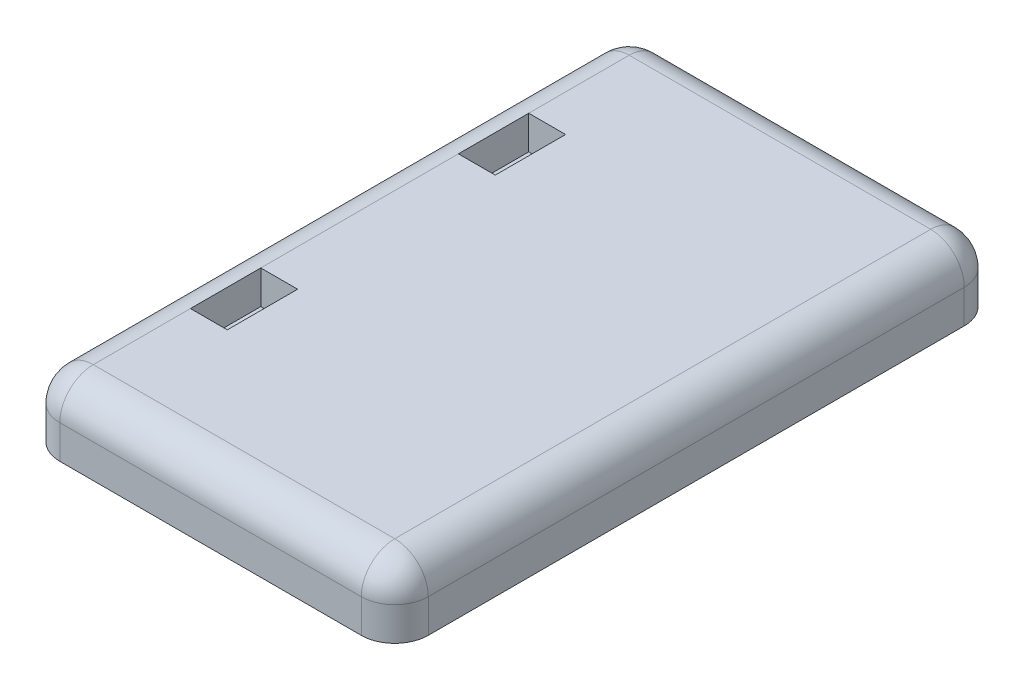
ISO-10303-21;
HEADER;
FILE_DESCRIPTION(('STEP AP214'),'2;1');
FILE_NAME('part.step','',(''),(''),'','','');
FILE_SCHEMA(('AUTOMOTIVE_DESIGN { 1 0 10303 214 1 1 1 1 }'));
ENDSEC;
DATA;
#1=APPLICATION_CONTEXT('core data for automotive mechanical design processes');
#2=APPLICATION_PROTOCOL_DEFINITION('international standard','automotive_design',2000,#1);
#3=PRODUCT_CONTEXT('',#1,'mechanical');
#4=PRODUCT('Part','Part','',(#3));
#5=PRODUCT_RELATED_PRODUCT_CATEGORY('part','',(#4));
#6=PRODUCT_DEFINITION_FORMATION('','',#4);
#7=PRODUCT_DEFINITION_CONTEXT('part definition',#1,'design');
#8=PRODUCT_DEFINITION('design','',#6,#7);
#9=PRODUCT_DEFINITION_SHAPE('','',#8);
#10=(LENGTH_UNIT() NAMED_UNIT(*) SI_UNIT(.MILLI.,.METRE.));
#11=(NAMED_UNIT(*) PLANE_ANGLE_UNIT() SI_UNIT($,.RADIAN.));
#12=(NAMED_UNIT(*) SI_UNIT($,.STERADIAN.) SOLID_ANGLE_UNIT());
#13=UNCERTAINTY_MEASURE_WITH_UNIT(LENGTH_MEASURE(1.E-05),#10,'distance_accuracy_value','');
#14=(GEOMETRIC_REPRESENTATION_CONTEXT(3) GLOBAL_UNCERTAINTY_ASSIGNED_CONTEXT((#13)) GLOBAL_UNIT_ASSIGNED_CONTEXT((#10,
#11,#12)) REPRESENTATION_CONTEXT('',''));
#15=CARTESIAN_POINT('',(0.,0.,0.));
#16=DIRECTION('',(0.,0.,1.));
#17=DIRECTION('',(1.,0.,0.));
#18=AXIS2_PLACEMENT_3D('',#15,#16,#17);
#19=CARTESIAN_POINT('',(27.5,10.,45.));
#20=DIRECTION('',(-1.,0.,0.));
#21=DIRECTION('',(0.,0.,1.));
#22=AXIS2_PLACEMENT_3D('',#19,#20,#21);
#23=PLANE('',#22);
#24=DIRECTION('',(0.,0.,-1.));
#25=VECTOR('',#24,1.);
#26=CARTESIAN_POINT('',(27.5,5.,45.));
#27=LINE('',#26,#25);
#28=CARTESIAN_POINT('',(27.5,5.,-40.));
#29=VERTEX_POINT('',#28);
#30=CARTESIAN_POINT('',(27.5,5.,40.));
#31=VERTEX_POINT('',#30);
#32=EDGE_CURVE('E326',#29,#31,#27,.F.);
#33=ORIENTED_EDGE('',*,*,#32,.T.);
#34=DIRECTION('',(0.,-1.,0.));
#35=VECTOR('',#34,1.);
#36=CARTESIAN_POINT('',(27.5,10.,40.));
#37=LINE('',#36,#35);
#38=CARTESIAN_POINT('',(27.5,0.,40.));
#39=VERTEX_POINT('',#38);
#40=EDGE_CURVE('E369',#31,#39,#37,.T.);
#41=ORIENTED_EDGE('',*,*,#40,.T.);
#42=DIRECTION('',(0.,0.,-1.));
#43=VECTOR('',#42,1.);
#44=CARTESIAN_POINT('',(27.5,0.,45.));
#45=LINE('',#44,#43);
#46=CARTESIAN_POINT('',(27.5,0.,-40.));
#47=VERTEX_POINT('',#46);
#48=EDGE_CURVE('E264',#39,#47,#45,.T.);
#49=ORIENTED_EDGE('',*,*,#48,.T.);
#50=DIRECTION('',(0.,-1.,0.));
#51=VECTOR('',#50,1.);
#52=CARTESIAN_POINT('',(27.5,10.,-40.));
#53=LINE('',#52,#51);
#54=EDGE_CURVE('E330',#47,#29,#53,.F.);
#55=ORIENTED_EDGE('',*,*,#54,.T.);
#56=EDGE_LOOP('',(#33,#41,#49,#55));
#57=FACE_BOUND('',#56,.T.);
#58=ADVANCED_FACE('F46',(#57),#23,.F.);
#59=CARTESIAN_POINT('',(-27.5,10.,-45.));
#60=DIRECTION('',(0.,0.,1.));
#61=DIRECTION('',(1.,0.,0.));
#62=AXIS2_PLACEMENT_3D('',#59,#60,#61);
#63=PLANE('',#62);
#64=DIRECTION('',(-1.,0.,0.));
#65=VECTOR('',#64,1.);
#66=CARTESIAN_POINT('',(-27.5,5.,-45.));
#67=LINE('',#66,#65);
#68=CARTESIAN_POINT('',(-22.5,5.,-45.));
#69=VERTEX_POINT('',#68);
#70=CARTESIAN_POINT('',(22.5,5.,-45.));
#71=VERTEX_POINT('',#70);
#72=EDGE_CURVE('E296',#69,#71,#67,.F.);
#73=ORIENTED_EDGE('',*,*,#72,.T.);
#74=DIRECTION('',(0.,-1.,0.));
#75=VECTOR('',#74,1.);
#76=CARTESIAN_POINT('',(22.5,10.,-45.));
#77=LINE('',#76,#75);
#78=CARTESIAN_POINT('',(22.5,0.,-45.));
#79=VERTEX_POINT('',#78);
#80=EDGE_CURVE('E310',#71,#79,#77,.T.);
#81=ORIENTED_EDGE('',*,*,#80,.T.);
#82=DIRECTION('',(-1.,0.,0.));
#83=VECTOR('',#82,1.);
#84=CARTESIAN_POINT('',(-27.5,0.,-45.));
#85=LINE('',#84,#83);
#86=CARTESIAN_POINT('',(-22.5,0.,-45.));
#87=VERTEX_POINT('',#86);
#88=EDGE_CURVE('E267',#79,#87,#85,.T.);
#89=ORIENTED_EDGE('',*,*,#88,.T.);
#90=DIRECTION('',(0.,-1.,0.));
#91=VECTOR('',#90,1.);
#92=CARTESIAN_POINT('',(-22.5,10.,-45.));
#93=LINE('',#92,#91);
#94=EDGE_CURVE('E300',#87,#69,#93,.F.);
#95=ORIENTED_EDGE('',*,*,#94,.T.);
#96=EDGE_LOOP('',(#73,#81,#89,#95));
#97=FACE_BOUND('',#96,.T.);
#98=ADVANCED_FACE('F422',(#97),#63,.F.);
#99=CARTESIAN_POINT('',(-27.5,10.,45.));
#100=DIRECTION('',(1.,0.,0.));
#101=DIRECTION('',(0.,0.,-1.));
#102=AXIS2_PLACEMENT_3D('',#99,#100,#101);
#103=PLANE('',#102);
#104=DIRECTION('',(0.,0.,1.));
#105=VECTOR('',#104,1.);
#106=CARTESIAN_POINT('',(-27.5,0.,45.));
#107=LINE('',#106,#105);
#108=CARTESIAN_POINT('',(-27.5,0.,-40.));
#109=VERTEX_POINT('',#108);
#110=CARTESIAN_POINT('',(-27.5,0.,40.));
#111=VERTEX_POINT('',#110);
#112=EDGE_CURVE('E271',#109,#111,#107,.T.);
#113=ORIENTED_EDGE('',*,*,#112,.T.);
#114=DIRECTION('',(0.,-1.,0.));
#115=VECTOR('',#114,1.);
#116=CARTESIAN_POINT('',(-27.5,10.,40.));
#117=LINE('',#116,#115);
#118=CARTESIAN_POINT('',(-27.5,5.,40.));
#119=VERTEX_POINT('',#118);
#120=EDGE_CURVE('E362',#111,#119,#117,.F.);
#121=ORIENTED_EDGE('',*,*,#120,.T.);
#122=DIRECTION('',(0.,0.,1.));
#123=VECTOR('',#122,1.);
#124=CARTESIAN_POINT('',(-27.5,5.,45.));
#125=LINE('',#124,#123);
#126=CARTESIAN_POINT('',(-27.5,5.,-40.));
#127=VERTEX_POINT('',#126);
#128=EDGE_CURVE('E284',#119,#127,#125,.F.);
#129=ORIENTED_EDGE('',*,*,#128,.T.);
#130=DIRECTION('',(0.,-1.,0.));
#131=VECTOR('',#130,1.);
#132=CARTESIAN_POINT('',(-27.5,10.,-40.));
#133=LINE('',#132,#131);
#134=EDGE_CURVE('E288',#127,#109,#133,.T.);
#135=ORIENTED_EDGE('',*,*,#134,.T.);
#136=EDGE_LOOP('',(#113,#121,#129,#135));
#137=FACE_BOUND('',#136,.T.);
#138=ADVANCED_FACE('F455',(#137),#103,.F.);
#139=CARTESIAN_POINT('',(-27.5,10.,45.));
#140=DIRECTION('',(0.,0.,-1.));
#141=DIRECTION('',(-1.,0.,0.));
#142=AXIS2_PLACEMENT_3D('',#139,#140,#141);
#143=PLANE('',#142);
#144=DIRECTION('',(1.,0.,0.));
#145=VECTOR('',#144,1.);
#146=CARTESIAN_POINT('',(-27.5,5.,45.));
#147=LINE('',#146,#145);
#148=CARTESIAN_POINT('',(22.5,5.,45.));
#149=VERTEX_POINT('',#148);
#150=CARTESIAN_POINT('',(-22.5,5.,45.));
#151=VERTEX_POINT('',#150);
#152=EDGE_CURVE('E339',#149,#151,#147,.F.);
#153=ORIENTED_EDGE('',*,*,#152,.T.);
#154=DIRECTION('',(0.,-1.,0.));
#155=VECTOR('',#154,1.);
#156=CARTESIAN_POINT('',(-22.5,10.,45.));
#157=LINE('',#156,#155);
#158=CARTESIAN_POINT('',(-22.5,0.,45.));
#159=VERTEX_POINT('',#158);
#160=EDGE_CURVE('E352',#151,#159,#157,.T.);
#161=ORIENTED_EDGE('',*,*,#160,.T.);
#162=DIRECTION('',(1.,0.,0.));
#163=VECTOR('',#162,1.);
#164=CARTESIAN_POINT('',(-27.5,0.,45.));
#165=LINE('',#164,#163);
#166=CARTESIAN_POINT('',(22.5,0.,45.));
#167=VERTEX_POINT('',#166);
#168=EDGE_CURVE('E275',#159,#167,#165,.T.);
#169=ORIENTED_EDGE('',*,*,#168,.T.);
#170=DIRECTION('',(0.,-1.,0.));
#171=VECTOR('',#170,1.);
#172=CARTESIAN_POINT('',(22.5,10.,45.));
#173=LINE('',#172,#171);
#174=EDGE_CURVE('E349',#167,#149,#173,.F.);
#175=ORIENTED_EDGE('',*,*,#174,.T.);
#176=EDGE_LOOP('',(#153,#161,#169,#175));
#177=FACE_BOUND('',#176,.T.);
#178=ADVANCED_FACE('F452',(#177),#143,.F.);
#179=CARTESIAN_POINT('',(0.,10.,0.));
#180=DIRECTION('',(0.,-1.,0.));
#181=DIRECTION('',(0.,0.,-1.));
#182=AXIS2_PLACEMENT_3D('',#179,#180,#181);
#183=PLANE('',#182);
#184=DIRECTION('',(0.,0.,1.));
#185=VECTOR('',#184,1.);
#186=CARTESIAN_POINT('',(-17.,10.,0.));
#187=LINE('',#186,#185);
#188=CARTESIAN_POINT('',(-17.,10.,-25.));
#189=VERTEX_POINT('',#188);
#190=CARTESIAN_POINT('',(-17.,10.,-14.5));
#191=VERTEX_POINT('',#190);
#192=EDGE_CURVE('E189',#189,#191,#187,.T.);
#193=ORIENTED_EDGE('',*,*,#192,.T.);
#194=DIRECTION('',(1.,0.,0.));
#195=VECTOR('',#194,1.);
#196=CARTESIAN_POINT('',(0.,10.,-14.5));
#197=LINE('',#196,#195);
#198=CARTESIAN_POINT('',(-22.5,10.,-14.5));
#199=VERTEX_POINT('',#198);
#200=EDGE_CURVE('E197',#199,#191,#197,.T.);
#201=ORIENTED_EDGE('',*,*,#200,.F.);
#202=DIRECTION('',(0.,0.,1.));
#203=VECTOR('',#202,1.);
#204=CARTESIAN_POINT('',(-22.5,10.,0.));
#205=LINE('',#204,#203);
#206=CARTESIAN_POINT('',(-22.5,10.,15.));
#207=VERTEX_POINT('',#206);
#208=EDGE_CURVE('E285',#199,#207,#205,.T.);
#209=ORIENTED_EDGE('',*,*,#208,.T.);
#210=DIRECTION('',(1.,0.,0.));
#211=VECTOR('',#210,1.);
#212=CARTESIAN_POINT('',(-22.5,10.,15.));
#213=LINE('',#212,#211);
#214=CARTESIAN_POINT('',(-17.,10.,15.));
#215=VERTEX_POINT('',#214);
#216=EDGE_CURVE('E64',#207,#215,#213,.T.);
#217=ORIENTED_EDGE('',*,*,#216,.T.);
#218=DIRECTION('',(0.,0.,1.));
#219=VECTOR('',#218,1.);
#220=CARTESIAN_POINT('',(-17.,10.,15.));
#221=LINE('',#220,#219);
#222=CARTESIAN_POINT('',(-17.,10.,25.5));
#223=VERTEX_POINT('',#222);
#224=EDGE_CURVE('E245',#215,#223,#221,.T.);
#225=ORIENTED_EDGE('',*,*,#224,.T.);
#226=DIRECTION('',(1.,0.,0.));
#227=VECTOR('',#226,1.);
#228=CARTESIAN_POINT('',(-22.5,10.,25.5));
#229=LINE('',#228,#227);
#230=CARTESIAN_POINT('',(-22.5,10.,25.5));
#231=VERTEX_POINT('',#230);
#232=EDGE_CURVE('E210',#231,#223,#229,.T.);
#233=ORIENTED_EDGE('',*,*,#232,.F.);
#234=CARTESIAN_POINT('',(-22.5,10.,40.));
#235=VERTEX_POINT('',#234);
#236=EDGE_CURVE('E279',#231,#235,#205,.T.);
#237=ORIENTED_EDGE('',*,*,#236,.T.);
#238=DIRECTION('',(1.,0.,0.));
#239=VECTOR('',#238,1.);
#240=CARTESIAN_POINT('',(0.,10.,40.));
#241=LINE('',#240,#239);
#242=CARTESIAN_POINT('',(22.5,10.,40.));
#243=VERTEX_POINT('',#242);
#244=EDGE_CURVE('E11',#235,#243,#241,.T.);
#245=ORIENTED_EDGE('',*,*,#244,.T.);
#246=DIRECTION('',(0.,0.,-1.));
#247=VECTOR('',#246,1.);
#248=CARTESIAN_POINT('',(22.5,10.,0.));
#249=LINE('',#248,#247);
#250=CARTESIAN_POINT('',(22.5,10.,-40.));
#251=VERTEX_POINT('',#250);
#252=EDGE_CURVE('E336',#243,#251,#249,.T.);
#253=ORIENTED_EDGE('',*,*,#252,.T.);
#254=DIRECTION('',(-1.,0.,0.));
#255=VECTOR('',#254,1.);
#256=CARTESIAN_POINT('',(0.,10.,-40.));
#257=LINE('',#256,#255);
#258=CARTESIAN_POINT('',(-22.5,10.,-40.));
#259=VERTEX_POINT('',#258);
#260=EDGE_CURVE('E307',#251,#259,#257,.T.);
#261=ORIENTED_EDGE('',*,*,#260,.T.);
#262=CARTESIAN_POINT('',(-22.5,10.,-25.));
#263=VERTEX_POINT('',#262);
#264=EDGE_CURVE('E280',#259,#263,#205,.T.);
#265=ORIENTED_EDGE('',*,*,#264,.T.);
#266=DIRECTION('',(1.,0.,0.));
#267=VECTOR('',#266,1.);
#268=CARTESIAN_POINT('',(0.,10.,-25.));
#269=LINE('',#268,#267);
#270=EDGE_CURVE('E72',#263,#189,#269,.T.);
#271=ORIENTED_EDGE('',*,*,#270,.T.);
#272=EDGE_LOOP('',(#193,#201,#209,#217,#225,#233,#237,#245,#253,#261,#265,#271));
#273=FACE_BOUND('',#272,.T.);
#274=ADVANCED_FACE('F439',(#273),#183,.F.);
#275=CARTESIAN_POINT('',(0.,0.,0.));
#276=DIRECTION('',(0.,-1.,0.));
#277=DIRECTION('',(0.,0.,-1.));
#278=AXIS2_PLACEMENT_3D('',#275,#276,#277);
#279=PLANE('',#278);
#280=ORIENTED_EDGE('',*,*,#168,.F.);
#281=CARTESIAN_POINT('',(-22.5,0.,40.));
#282=DIRECTION('',(0.,-1.,0.));
#283=DIRECTION('',(0.,0.,-1.));
#284=AXIS2_PLACEMENT_3D('',#281,#282,#283);
#285=CIRCLE('',#284,5.);
#286=EDGE_CURVE('E359',#159,#111,#285,.T.);
#287=ORIENTED_EDGE('',*,*,#286,.T.);
#288=ORIENTED_EDGE('',*,*,#112,.F.);
#289=CARTESIAN_POINT('',(-22.5,0.,-40.));
#290=DIRECTION('',(0.,-1.,0.));
#291=DIRECTION('',(0.,0.,-1.));
#292=AXIS2_PLACEMENT_3D('',#289,#290,#291);
#293=CIRCLE('',#292,5.);
#294=EDGE_CURVE('E292',#109,#87,#293,.T.);
#295=ORIENTED_EDGE('',*,*,#294,.T.);
#296=ORIENTED_EDGE('',*,*,#88,.F.);
#297=CARTESIAN_POINT('',(22.5,0.,-40.));
#298=DIRECTION('',(0.,-1.,0.));
#299=DIRECTION('',(0.,0.,-1.));
#300=AXIS2_PLACEMENT_3D('',#297,#298,#299);
#301=CIRCLE('',#300,5.);
#302=EDGE_CURVE('E322',#79,#47,#301,.T.);
#303=ORIENTED_EDGE('',*,*,#302,.T.);
#304=ORIENTED_EDGE('',*,*,#48,.F.);
#305=CARTESIAN_POINT('',(22.5,0.,40.));
#306=DIRECTION('',(0.,-1.,0.));
#307=DIRECTION('',(0.,0.,-1.));
#308=AXIS2_PLACEMENT_3D('',#305,#306,#307);
#309=CIRCLE('',#308,5.);
#310=EDGE_CURVE('E356',#39,#167,#309,.T.);
#311=ORIENTED_EDGE('',*,*,#310,.T.);
#312=EDGE_LOOP('',(#280,#287,#288,#295,#296,#303,#304,#311));
#313=FACE_BOUND('',#312,.T.);
#314=ADVANCED_FACE('F402',(#313),#279,.T.);
#315=CARTESIAN_POINT('',(-22.5,5.,0.));
#316=DIRECTION('',(0.,0.,1.));
#317=DIRECTION('',(1.,0.,0.));
#318=AXIS2_PLACEMENT_3D('',#315,#316,#317);
#319=CYLINDRICAL_SURFACE('',#318,5.);
#320=ORIENTED_EDGE('',*,*,#128,.F.);
#321=CARTESIAN_POINT('',(-22.5,5.,40.));
#322=DIRECTION('',(0.,0.,1.));
#323=DIRECTION('',(1.,0.,0.));
#324=AXIS2_PLACEMENT_3D('',#321,#322,#323);
#325=CIRCLE('',#324,5.);
#326=EDGE_CURVE('E365',#119,#235,#325,.F.);
#327=ORIENTED_EDGE('',*,*,#326,.T.);
#328=ORIENTED_EDGE('',*,*,#236,.F.);
#329=DIRECTION('',(0.,0.,1.));
#330=VECTOR('',#329,1.);
#331=CARTESIAN_POINT('',(-22.5,10.,15.));
#332=LINE('',#331,#330);
#333=EDGE_CURVE('E238',#207,#231,#332,.T.);
#334=ORIENTED_EDGE('',*,*,#333,.F.);
#335=ORIENTED_EDGE('',*,*,#208,.F.);
#336=DIRECTION('',(0.,0.,1.));
#337=VECTOR('',#336,1.);
#338=CARTESIAN_POINT('',(-22.5,10.,0.));
#339=LINE('',#338,#337);
#340=EDGE_CURVE('E201',#263,#199,#339,.T.);
#341=ORIENTED_EDGE('',*,*,#340,.F.);
#342=ORIENTED_EDGE('',*,*,#264,.F.);
#343=CARTESIAN_POINT('',(-22.5,5.,-40.));
#344=DIRECTION('',(0.,0.,1.));
#345=DIRECTION('',(1.,0.,0.));
#346=AXIS2_PLACEMENT_3D('',#343,#344,#345);
#347=CIRCLE('',#346,5.);
#348=EDGE_CURVE('E303',#259,#127,#347,.T.);
#349=ORIENTED_EDGE('',*,*,#348,.T.);
#350=EDGE_LOOP('',(#320,#327,#328,#334,#335,#341,#342,#349));
#351=FACE_BOUND('',#350,.T.);
#352=ADVANCED_FACE('F434',(#351),#319,.T.);
#353=CARTESIAN_POINT('',(0.,5.,-40.));
#354=DIRECTION('',(-1.,0.,0.));
#355=DIRECTION('',(0.,0.,1.));
#356=AXIS2_PLACEMENT_3D('',#353,#354,#355);
#357=CYLINDRICAL_SURFACE('',#356,5.);
#358=ORIENTED_EDGE('',*,*,#260,.F.);
#359=CARTESIAN_POINT('',(22.5,5.,-40.));
#360=DIRECTION('',(-1.,0.,0.));
#361=DIRECTION('',(0.,0.,1.));
#362=AXIS2_PLACEMENT_3D('',#359,#360,#361);
#363=CIRCLE('',#362,5.);
#364=EDGE_CURVE('E333',#251,#71,#363,.T.);
#365=ORIENTED_EDGE('',*,*,#364,.T.);
#366=ORIENTED_EDGE('',*,*,#72,.F.);
#367=CARTESIAN_POINT('',(-22.5,5.,-40.));
#368=DIRECTION('',(-1.,0.,0.));
#369=DIRECTION('',(0.,0.,1.));
#370=AXIS2_PLACEMENT_3D('',#367,#368,#369);
#371=CIRCLE('',#370,5.);
#372=EDGE_CURVE('E268',#259,#69,#371,.T.);
#373=ORIENTED_EDGE('',*,*,#372,.F.);
#374=EDGE_LOOP('',(#358,#365,#366,#373));
#375=FACE_BOUND('',#374,.T.);
#376=ADVANCED_FACE('F419',(#375),#357,.T.);
#377=CARTESIAN_POINT('',(-22.5,5.,-40.));
#378=DIRECTION('',(0.,0.,1.));
#379=DIRECTION('',(1.,0.,0.));
#380=AXIS2_PLACEMENT_3D('',#377,#378,#379);
#381=SPHERICAL_SURFACE('',#380,5.);
#382=ORIENTED_EDGE('',*,*,#348,.F.);
#383=ORIENTED_EDGE('',*,*,#372,.T.);
#384=CARTESIAN_POINT('',(-22.5,5.,-40.));
#385=DIRECTION('',(0.,-1.,0.));
#386=DIRECTION('',(0.,0.,-1.));
#387=AXIS2_PLACEMENT_3D('',#384,#385,#386);
#388=CIRCLE('',#387,5.);
#389=EDGE_CURVE('E311',#127,#69,#388,.T.);
#390=ORIENTED_EDGE('',*,*,#389,.F.);
#391=EDGE_LOOP('',(#382,#383,#390));
#392=FACE_BOUND('',#391,.T.);
#393=ADVANCED_FACE('F430',(#392),#381,.T.);
#394=CARTESIAN_POINT('',(-22.5,10.,-40.));
#395=DIRECTION('',(0.,-1.,0.));
#396=DIRECTION('',(0.,0.,-1.));
#397=AXIS2_PLACEMENT_3D('',#394,#395,#396);
#398=CYLINDRICAL_SURFACE('',#397,5.);
#399=ORIENTED_EDGE('',*,*,#389,.T.);
#400=ORIENTED_EDGE('',*,*,#94,.F.);
#401=ORIENTED_EDGE('',*,*,#294,.F.);
#402=ORIENTED_EDGE('',*,*,#134,.F.);
#403=EDGE_LOOP('',(#399,#400,#401,#402));
#404=FACE_BOUND('',#403,.T.);
#405=ADVANCED_FACE('F425',(#404),#398,.T.);
#406=CARTESIAN_POINT('',(22.5,5.,0.));
#407=DIRECTION('',(0.,0.,-1.));
#408=DIRECTION('',(-1.,0.,0.));
#409=AXIS2_PLACEMENT_3D('',#406,#407,#408);
#410=CYLINDRICAL_SURFACE('',#409,5.);
#411=ORIENTED_EDGE('',*,*,#252,.F.);
#412=CARTESIAN_POINT('',(22.5,5.,40.));
#413=DIRECTION('',(0.,0.,-1.));
#414=DIRECTION('',(-1.,0.,0.));
#415=AXIS2_PLACEMENT_3D('',#412,#413,#414);
#416=CIRCLE('',#415,5.);
#417=EDGE_CURVE('E56',#243,#31,#416,.T.);
#418=ORIENTED_EDGE('',*,*,#417,.T.);
#419=ORIENTED_EDGE('',*,*,#32,.F.);
#420=CARTESIAN_POINT('',(22.5,5.,-40.));
#421=DIRECTION('',(0.,0.,-1.));
#422=DIRECTION('',(-1.,0.,0.));
#423=AXIS2_PLACEMENT_3D('',#420,#421,#422);
#424=CIRCLE('',#423,5.);
#425=EDGE_CURVE('E315',#251,#29,#424,.T.);
#426=ORIENTED_EDGE('',*,*,#425,.F.);
#427=EDGE_LOOP('',(#411,#418,#419,#426));
#428=FACE_BOUND('',#427,.T.);
#429=ADVANCED_FACE('F412',(#428),#410,.T.);
#430=CARTESIAN_POINT('',(22.5,5.,-40.));
#431=DIRECTION('',(-1.,0.,0.));
#432=DIRECTION('',(0.,0.,1.));
#433=AXIS2_PLACEMENT_3D('',#430,#431,#432);
#434=SPHERICAL_SURFACE('',#433,5.);
#435=ORIENTED_EDGE('',*,*,#364,.F.);
#436=ORIENTED_EDGE('',*,*,#425,.T.);
#437=CARTESIAN_POINT('',(22.5,5.,-40.));
#438=DIRECTION('',(0.,-1.,0.));
#439=DIRECTION('',(0.,0.,-1.));
#440=AXIS2_PLACEMENT_3D('',#437,#438,#439);
#441=CIRCLE('',#440,5.);
#442=EDGE_CURVE('E340',#71,#29,#441,.T.);
#443=ORIENTED_EDGE('',*,*,#442,.F.);
#444=EDGE_LOOP('',(#435,#436,#443));
#445=FACE_BOUND('',#444,.T.);
#446=ADVANCED_FACE('F415',(#445),#434,.T.);
#447=CARTESIAN_POINT('',(22.5,10.,-40.));
#448=DIRECTION('',(0.,-1.,0.));
#449=DIRECTION('',(0.,0.,-1.));
#450=AXIS2_PLACEMENT_3D('',#447,#448,#449);
#451=CYLINDRICAL_SURFACE('',#450,5.);
#452=ORIENTED_EDGE('',*,*,#442,.T.);
#453=ORIENTED_EDGE('',*,*,#54,.F.);
#454=ORIENTED_EDGE('',*,*,#302,.F.);
#455=ORIENTED_EDGE('',*,*,#80,.F.);
#456=EDGE_LOOP('',(#452,#453,#454,#455));
#457=FACE_BOUND('',#456,.T.);
#458=ADVANCED_FACE('F407',(#457),#451,.T.);
#459=CARTESIAN_POINT('',(22.5,10.,40.));
#460=DIRECTION('',(0.,-1.,0.));
#461=DIRECTION('',(0.,0.,-1.));
#462=AXIS2_PLACEMENT_3D('',#459,#460,#461);
#463=CYLINDRICAL_SURFACE('',#462,5.);
#464=ORIENTED_EDGE('',*,*,#310,.F.);
#465=ORIENTED_EDGE('',*,*,#40,.F.);
#466=CARTESIAN_POINT('',(22.5,5.,40.));
#467=DIRECTION('',(0.,1.,0.));
#468=DIRECTION('',(0.,0.,1.));
#469=AXIS2_PLACEMENT_3D('',#466,#467,#468);
#470=CIRCLE('',#469,5.);
#471=EDGE_CURVE('E50',#149,#31,#470,.T.);
#472=ORIENTED_EDGE('',*,*,#471,.F.);
#473=ORIENTED_EDGE('',*,*,#174,.F.);
#474=EDGE_LOOP('',(#464,#465,#472,#473));
#475=FACE_BOUND('',#474,.T.);
#476=ADVANCED_FACE('F48',(#475),#463,.T.);
#477=CARTESIAN_POINT('',(22.5,5.,40.));
#478=DIRECTION('',(0.,0.,-1.));
#479=DIRECTION('',(-1.,0.,0.));
#480=AXIS2_PLACEMENT_3D('',#477,#478,#479);
#481=SPHERICAL_SURFACE('',#480,5.);
#482=ORIENTED_EDGE('',*,*,#471,.T.);
#483=ORIENTED_EDGE('',*,*,#417,.F.);
#484=CARTESIAN_POINT('',(22.5,5.,40.));
#485=DIRECTION('',(-1.,0.,0.));
#486=DIRECTION('',(0.,0.,1.));
#487=AXIS2_PLACEMENT_3D('',#484,#485,#486);
#488=CIRCLE('',#487,5.);
#489=EDGE_CURVE('E380',#149,#243,#488,.T.);
#490=ORIENTED_EDGE('',*,*,#489,.F.);
#491=EDGE_LOOP('',(#482,#483,#490));
#492=FACE_BOUND('',#491,.T.);
#493=ADVANCED_FACE('F392',(#492),#481,.T.);
#494=CARTESIAN_POINT('',(0.,5.,40.));
#495=DIRECTION('',(1.,0.,0.));
#496=DIRECTION('',(0.,0.,-1.));
#497=AXIS2_PLACEMENT_3D('',#494,#495,#496);
#498=CYLINDRICAL_SURFACE('',#497,5.);
#499=ORIENTED_EDGE('',*,*,#489,.T.);
#500=ORIENTED_EDGE('',*,*,#244,.F.);
#501=CARTESIAN_POINT('',(-22.5,5.,40.));
#502=DIRECTION('',(-1.,0.,0.));
#503=DIRECTION('',(0.,0.,1.));
#504=AXIS2_PLACEMENT_3D('',#501,#502,#503);
#505=CIRCLE('',#504,5.);
#506=EDGE_CURVE('E377',#151,#235,#505,.T.);
#507=ORIENTED_EDGE('',*,*,#506,.F.);
#508=ORIENTED_EDGE('',*,*,#152,.F.);
#509=EDGE_LOOP('',(#499,#500,#507,#508));
#510=FACE_BOUND('',#509,.T.);
#511=ADVANCED_FACE('F443',(#510),#498,.T.);
#512=CARTESIAN_POINT('',(-22.5,5.,40.));
#513=DIRECTION('',(0.,0.,-1.));
#514=DIRECTION('',(-1.,0.,0.));
#515=AXIS2_PLACEMENT_3D('',#512,#513,#514);
#516=SPHERICAL_SURFACE('',#515,5.);
#517=ORIENTED_EDGE('',*,*,#506,.T.);
#518=ORIENTED_EDGE('',*,*,#326,.F.);
#519=CARTESIAN_POINT('',(-22.5,5.,40.));
#520=DIRECTION('',(0.,-1.,0.));
#521=DIRECTION('',(0.,0.,-1.));
#522=AXIS2_PLACEMENT_3D('',#519,#520,#521);
#523=CIRCLE('',#522,5.);
#524=EDGE_CURVE('E219',#151,#119,#523,.T.);
#525=ORIENTED_EDGE('',*,*,#524,.F.);
#526=EDGE_LOOP('',(#517,#518,#525));
#527=FACE_BOUND('',#526,.T.);
#528=ADVANCED_FACE('F446',(#527),#516,.T.);
#529=CARTESIAN_POINT('',(-22.5,10.,40.));
#530=DIRECTION('',(0.,-1.,0.));
#531=DIRECTION('',(0.,0.,-1.));
#532=AXIS2_PLACEMENT_3D('',#529,#530,#531);
#533=CYLINDRICAL_SURFACE('',#532,5.);
#534=ORIENTED_EDGE('',*,*,#524,.T.);
#535=ORIENTED_EDGE('',*,*,#120,.F.);
#536=ORIENTED_EDGE('',*,*,#286,.F.);
#537=ORIENTED_EDGE('',*,*,#160,.F.);
#538=EDGE_LOOP('',(#534,#535,#536,#537));
#539=FACE_BOUND('',#538,.T.);
#540=ADVANCED_FACE('F450',(#539),#533,.T.);
#541=CARTESIAN_POINT('',(-22.5,5.,25.5));
#542=DIRECTION('',(0.,0.,1.));
#543=DIRECTION('',(1.,0.,0.));
#544=AXIS2_PLACEMENT_3D('',#541,#542,#543);
#545=PLANE('',#544);
#546=ORIENTED_EDGE('',*,*,#232,.T.);
#547=DIRECTION('',(0.,1.,0.));
#548=VECTOR('',#547,1.);
#549=CARTESIAN_POINT('',(-17.,5.,25.5));
#550=LINE('',#549,#548);
#551=CARTESIAN_POINT('',(-17.,5.,25.5));
#552=VERTEX_POINT('',#551);
#553=EDGE_CURVE('E225',#552,#223,#550,.T.);
#554=ORIENTED_EDGE('',*,*,#553,.F.);
#555=DIRECTION('',(1.,0.,0.));
#556=VECTOR('',#555,1.);
#557=CARTESIAN_POINT('',(-22.5,5.,25.5));
#558=LINE('',#557,#556);
#559=CARTESIAN_POINT('',(-22.5,5.,25.5));
#560=VERTEX_POINT('',#559);
#561=EDGE_CURVE('E242',#560,#552,#558,.T.);
#562=ORIENTED_EDGE('',*,*,#561,.F.);
#563=DIRECTION('',(0.,1.,0.));
#564=VECTOR('',#563,1.);
#565=CARTESIAN_POINT('',(-22.5,5.,25.5));
#566=LINE('',#565,#564);
#567=EDGE_CURVE('E235',#560,#231,#566,.T.);
#568=ORIENTED_EDGE('',*,*,#567,.T.);
#569=EDGE_LOOP('',(#546,#554,#562,#568));
#570=FACE_BOUND('',#569,.T.);
#571=ADVANCED_FACE('F485',(#570),#545,.F.);
#572=CARTESIAN_POINT('',(-22.5,5.,15.));
#573=DIRECTION('',(-1.,0.,0.));
#574=DIRECTION('',(0.,0.,1.));
#575=AXIS2_PLACEMENT_3D('',#572,#573,#574);
#576=PLANE('',#575);
#577=ORIENTED_EDGE('',*,*,#333,.T.);
#578=ORIENTED_EDGE('',*,*,#567,.F.);
#579=DIRECTION('',(0.,0.,1.));
#580=VECTOR('',#579,1.);
#581=CARTESIAN_POINT('',(-22.5,5.,15.));
#582=LINE('',#581,#580);
#583=CARTESIAN_POINT('',(-22.5,5.,15.));
#584=VERTEX_POINT('',#583);
#585=EDGE_CURVE('E228',#584,#560,#582,.T.);
#586=ORIENTED_EDGE('',*,*,#585,.F.);
#587=DIRECTION('',(0.,1.,0.));
#588=VECTOR('',#587,1.);
#589=CARTESIAN_POINT('',(-22.5,5.,15.));
#590=LINE('',#589,#588);
#591=EDGE_CURVE('E232',#584,#207,#590,.T.);
#592=ORIENTED_EDGE('',*,*,#591,.T.);
#593=EDGE_LOOP('',(#577,#578,#586,#592));
#594=FACE_BOUND('',#593,.T.);
#595=ADVANCED_FACE('F543',(#594),#576,.F.);
#596=CARTESIAN_POINT('',(-22.5,5.,15.));
#597=DIRECTION('',(0.,0.,1.));
#598=DIRECTION('',(1.,0.,0.));
#599=AXIS2_PLACEMENT_3D('',#596,#597,#598);
#600=PLANE('',#599);
#601=ORIENTED_EDGE('',*,*,#216,.F.);
#602=ORIENTED_EDGE('',*,*,#591,.F.);
#603=DIRECTION('',(1.,0.,0.));
#604=VECTOR('',#603,1.);
#605=CARTESIAN_POINT('',(-22.5,5.,15.));
#606=LINE('',#605,#604);
#607=CARTESIAN_POINT('',(-17.,5.,15.));
#608=VERTEX_POINT('',#607);
#609=EDGE_CURVE('E255',#584,#608,#606,.T.);
#610=ORIENTED_EDGE('',*,*,#609,.T.);
#611=DIRECTION('',(0.,1.,0.));
#612=VECTOR('',#611,1.);
#613=CARTESIAN_POINT('',(-17.,5.,15.));
#614=LINE('',#613,#612);
#615=EDGE_CURVE('E229',#608,#215,#614,.T.);
#616=ORIENTED_EDGE('',*,*,#615,.T.);
#617=EDGE_LOOP('',(#601,#602,#610,#616));
#618=FACE_BOUND('',#617,.T.);
#619=ADVANCED_FACE('F552',(#618),#600,.T.);
#620=CARTESIAN_POINT('',(-17.,5.,15.));
#621=DIRECTION('',(-1.,0.,0.));
#622=DIRECTION('',(0.,0.,1.));
#623=AXIS2_PLACEMENT_3D('',#620,#621,#622);
#624=PLANE('',#623);
#625=ORIENTED_EDGE('',*,*,#224,.F.);
#626=ORIENTED_EDGE('',*,*,#615,.F.);
#627=DIRECTION('',(0.,0.,1.));
#628=VECTOR('',#627,1.);
#629=CARTESIAN_POINT('',(-17.,5.,15.));
#630=LINE('',#629,#628);
#631=EDGE_CURVE('E258',#608,#552,#630,.T.);
#632=ORIENTED_EDGE('',*,*,#631,.T.);
#633=ORIENTED_EDGE('',*,*,#553,.T.);
#634=EDGE_LOOP('',(#625,#626,#632,#633));
#635=FACE_BOUND('',#634,.T.);
#636=ADVANCED_FACE('F561',(#635),#624,.T.);
#637=CARTESIAN_POINT('',(0.,5.,0.));
#638=DIRECTION('',(0.,-1.,0.));
#639=DIRECTION('',(0.,0.,-1.));
#640=AXIS2_PLACEMENT_3D('',#637,#638,#639);
#641=PLANE('',#640);
#642=ORIENTED_EDGE('',*,*,#561,.T.);
#643=ORIENTED_EDGE('',*,*,#631,.F.);
#644=ORIENTED_EDGE('',*,*,#609,.F.);
#645=ORIENTED_EDGE('',*,*,#585,.T.);
#646=EDGE_LOOP('',(#642,#643,#644,#645));
#647=FACE_BOUND('',#646,.T.);
#648=ADVANCED_FACE('F569',(#647),#641,.F.);
#649=CARTESIAN_POINT('',(-17.,5.,0.));
#650=DIRECTION('',(-1.,0.,0.));
#651=DIRECTION('',(0.,0.,1.));
#652=AXIS2_PLACEMENT_3D('',#649,#650,#651);
#653=PLANE('',#652);
#654=ORIENTED_EDGE('',*,*,#192,.F.);
#655=DIRECTION('',(0.,1.,0.));
#656=VECTOR('',#655,1.);
#657=CARTESIAN_POINT('',(-17.,5.,-25.));
#658=LINE('',#657,#656);
#659=CARTESIAN_POINT('',(-17.,5.,-25.));
#660=VERTEX_POINT('',#659);
#661=EDGE_CURVE('E174',#660,#189,#658,.T.);
#662=ORIENTED_EDGE('',*,*,#661,.F.);
#663=DIRECTION('',(0.,0.,1.));
#664=VECTOR('',#663,1.);
#665=CARTESIAN_POINT('',(-17.,5.,0.));
#666=LINE('',#665,#664);
#667=CARTESIAN_POINT('',(-17.,5.,-14.5));
#668=VERTEX_POINT('',#667);
#669=EDGE_CURVE('E183',#660,#668,#666,.T.);
#670=ORIENTED_EDGE('',*,*,#669,.T.);
#671=DIRECTION('',(0.,1.,0.));
#672=VECTOR('',#671,1.);
#673=CARTESIAN_POINT('',(-17.,5.,-14.5));
#674=LINE('',#673,#672);
#675=EDGE_CURVE('E216',#668,#191,#674,.T.);
#676=ORIENTED_EDGE('',*,*,#675,.T.);
#677=EDGE_LOOP('',(#654,#662,#670,#676));
#678=FACE_BOUND('',#677,.T.);
#679=ADVANCED_FACE('F186',(#678),#653,.T.);
#680=CARTESIAN_POINT('',(0.,5.,-14.5));
#681=DIRECTION('',(0.,0.,1.));
#682=DIRECTION('',(1.,0.,0.));
#683=AXIS2_PLACEMENT_3D('',#680,#681,#682);
#684=PLANE('',#683);
#685=ORIENTED_EDGE('',*,*,#200,.T.);
#686=ORIENTED_EDGE('',*,*,#675,.F.);
#687=DIRECTION('',(1.,0.,0.));
#688=VECTOR('',#687,1.);
#689=CARTESIAN_POINT('',(0.,5.,-14.5));
#690=LINE('',#689,#688);
#691=CARTESIAN_POINT('',(-22.5,5.,-14.5));
#692=VERTEX_POINT('',#691);
#693=EDGE_CURVE('E191',#692,#668,#690,.T.);
#694=ORIENTED_EDGE('',*,*,#693,.F.);
#695=DIRECTION('',(0.,1.,0.));
#696=VECTOR('',#695,1.);
#697=CARTESIAN_POINT('',(-22.5,5.,-14.5));
#698=LINE('',#697,#696);
#699=EDGE_CURVE('E220',#692,#199,#698,.T.);
#700=ORIENTED_EDGE('',*,*,#699,.T.);
#701=EDGE_LOOP('',(#685,#686,#694,#700));
#702=FACE_BOUND('',#701,.T.);
#703=ADVANCED_FACE('F586',(#702),#684,.F.);
#704=CARTESIAN_POINT('',(-22.5,5.,0.));
#705=DIRECTION('',(-1.,0.,0.));
#706=DIRECTION('',(0.,0.,1.));
#707=AXIS2_PLACEMENT_3D('',#704,#705,#706);
#708=PLANE('',#707);
#709=ORIENTED_EDGE('',*,*,#340,.T.);
#710=ORIENTED_EDGE('',*,*,#699,.F.);
#711=DIRECTION('',(0.,0.,1.));
#712=VECTOR('',#711,1.);
#713=CARTESIAN_POINT('',(-22.5,5.,0.));
#714=LINE('',#713,#712);
#715=CARTESIAN_POINT('',(-22.5,5.,-25.));
#716=VERTEX_POINT('',#715);
#717=EDGE_CURVE('E182',#716,#692,#714,.T.);
#718=ORIENTED_EDGE('',*,*,#717,.F.);
#719=DIRECTION('',(0.,1.,0.));
#720=VECTOR('',#719,1.);
#721=CARTESIAN_POINT('',(-22.5,5.,-25.));
#722=LINE('',#721,#720);
#723=EDGE_CURVE('E176',#716,#263,#722,.T.);
#724=ORIENTED_EDGE('',*,*,#723,.T.);
#725=EDGE_LOOP('',(#709,#710,#718,#724));
#726=FACE_BOUND('',#725,.T.);
#727=ADVANCED_FACE('F594',(#726),#708,.F.);
#728=CARTESIAN_POINT('',(0.,5.,-25.));
#729=DIRECTION('',(0.,0.,1.));
#730=DIRECTION('',(1.,0.,0.));
#731=AXIS2_PLACEMENT_3D('',#728,#729,#730);
#732=PLANE('',#731);
#733=ORIENTED_EDGE('',*,*,#270,.F.);
#734=ORIENTED_EDGE('',*,*,#723,.F.);
#735=DIRECTION('',(1.,0.,0.));
#736=VECTOR('',#735,1.);
#737=CARTESIAN_POINT('',(0.,5.,-25.));
#738=LINE('',#737,#736);
#739=EDGE_CURVE('E171',#716,#660,#738,.T.);
#740=ORIENTED_EDGE('',*,*,#739,.T.);
#741=ORIENTED_EDGE('',*,*,#661,.T.);
#742=EDGE_LOOP('',(#733,#734,#740,#741));
#743=FACE_BOUND('',#742,.T.);
#744=ADVANCED_FACE('F173',(#743),#732,.T.);
#745=CARTESIAN_POINT('',(0.,5.,0.));
#746=DIRECTION('',(0.,1.,0.));
#747=DIRECTION('',(0.,0.,1.));
#748=AXIS2_PLACEMENT_3D('',#745,#746,#747);
#749=PLANE('',#748);
#750=ORIENTED_EDGE('',*,*,#669,.F.);
#751=ORIENTED_EDGE('',*,*,#739,.F.);
#752=ORIENTED_EDGE('',*,*,#717,.T.);
#753=ORIENTED_EDGE('',*,*,#693,.T.);
#754=EDGE_LOOP('',(#750,#751,#752,#753));
#755=FACE_BOUND('',#754,.T.);
#756=ADVANCED_FACE('F194',(#755),#749,.T.);
#757=CLOSED_SHELL('',(#58,#98,#138,#178,#274,#314,#352,#376,#393,#405,#429,#446,#458,#476,#493,
#511,#528,#540,#571,#595,#619,#636,#648,#679,#703,#727,#744,#756));
#758=MANIFOLD_SOLID_BREP('B2',#757);
#759=ADVANCED_BREP_SHAPE_REPRESENTATION('',(#18,#758),#14);
#760=SHAPE_DEFINITION_REPRESENTATION(#9,#759);
ENDSEC;
END-ISO-10303-21;
